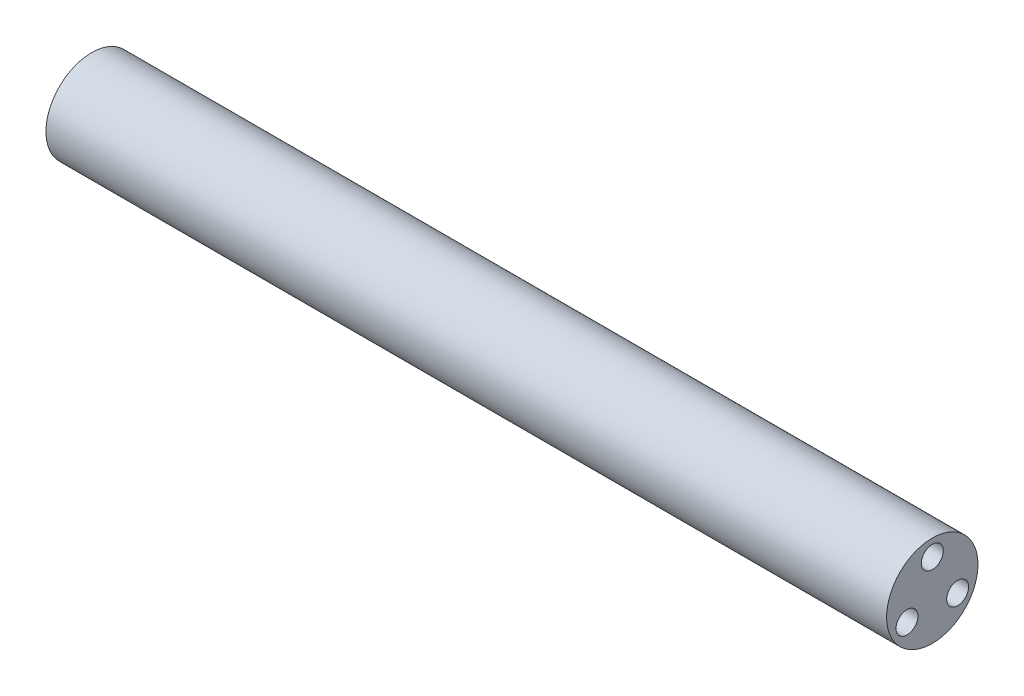
ISO-10303-21;
HEADER;
FILE_DESCRIPTION(('STEP AP214'),'2;1');
FILE_NAME('part.step','',(''),(''),'','','');
FILE_SCHEMA(('AUTOMOTIVE_DESIGN { 1 0 10303 214 1 1 1 1 }'));
ENDSEC;
DATA;
#1=APPLICATION_CONTEXT('core data for automotive mechanical design processes');
#2=APPLICATION_PROTOCOL_DEFINITION('international standard','automotive_design',2000,#1);
#3=PRODUCT_CONTEXT('',#1,'mechanical');
#4=PRODUCT('Part','Part','',(#3));
#5=PRODUCT_RELATED_PRODUCT_CATEGORY('part','',(#4));
#6=PRODUCT_DEFINITION_FORMATION('','',#4);
#7=PRODUCT_DEFINITION_CONTEXT('part definition',#1,'design');
#8=PRODUCT_DEFINITION('design','',#6,#7);
#9=PRODUCT_DEFINITION_SHAPE('','',#8);
#10=(LENGTH_UNIT() NAMED_UNIT(*) SI_UNIT(.MILLI.,.METRE.));
#11=(NAMED_UNIT(*) PLANE_ANGLE_UNIT() SI_UNIT($,.RADIAN.));
#12=(NAMED_UNIT(*) SI_UNIT($,.STERADIAN.) SOLID_ANGLE_UNIT());
#13=UNCERTAINTY_MEASURE_WITH_UNIT(LENGTH_MEASURE(1.E-05),#10,'distance_accuracy_value','');
#14=(GEOMETRIC_REPRESENTATION_CONTEXT(3) GLOBAL_UNCERTAINTY_ASSIGNED_CONTEXT((#13)) GLOBAL_UNIT_ASSIGNED_CONTEXT((#10,
#11,#12)) REPRESENTATION_CONTEXT('',''));
#15=CARTESIAN_POINT('',(0.,0.,0.));
#16=DIRECTION('',(0.,0.,1.));
#17=DIRECTION('',(1.,0.,0.));
#18=AXIS2_PLACEMENT_3D('',#15,#16,#17);
#19=CARTESIAN_POINT('',(230.,0.,0.));
#20=DIRECTION('',(-1.,0.,0.));
#21=DIRECTION('',(0.,0.,1.));
#22=AXIS2_PLACEMENT_3D('',#19,#20,#21);
#23=CYLINDRICAL_SURFACE('',#22,12.5);
#24=CARTESIAN_POINT('',(230.,0.,0.));
#25=DIRECTION('',(1.,0.,0.));
#26=DIRECTION('',(0.,0.,-1.));
#27=AXIS2_PLACEMENT_3D('',#24,#25,#26);
#28=CIRCLE('',#27,12.5);
#29=CARTESIAN_POINT('',(230.,0.,-12.5));
#30=VERTEX_POINT('',#29);
#31=EDGE_CURVE('E10',#30,#30,#28,.T.);
#32=ORIENTED_EDGE('',*,*,#31,.F.);
#33=EDGE_LOOP('',(#32));
#34=FACE_BOUND('',#33,.T.);
#35=CARTESIAN_POINT('',(0.,0.,0.));
#36=DIRECTION('',(1.,0.,0.));
#37=DIRECTION('',(0.,0.,-1.));
#38=AXIS2_PLACEMENT_3D('',#35,#36,#37);
#39=CIRCLE('',#38,12.5);
#40=CARTESIAN_POINT('',(0.,0.,-12.5));
#41=VERTEX_POINT('',#40);
#42=EDGE_CURVE('E42',#41,#41,#39,.T.);
#43=ORIENTED_EDGE('',*,*,#42,.T.);
#44=EDGE_LOOP('',(#43));
#45=FACE_BOUND('',#44,.T.);
#46=ADVANCED_FACE('F39',(#34,#45),#23,.T.);
#47=CARTESIAN_POINT('',(230.,0.,0.));
#48=DIRECTION('',(1.,0.,0.));
#49=DIRECTION('',(0.,0.,-1.));
#50=AXIS2_PLACEMENT_3D('',#47,#48,#49);
#51=PLANE('',#50);
#52=CARTESIAN_POINT('',(230.,-4.00000000000003,-6.92820323027549));
#53=DIRECTION('',(1.,0.,0.));
#54=DIRECTION('',(0.,-0.866025403784436,0.500000000000004));
#55=AXIS2_PLACEMENT_3D('',#52,#53,#54);
#56=CIRCLE('',#55,3.);
#57=CARTESIAN_POINT('',(230.,-6.59807621135334,-5.42820323027548));
#58=VERTEX_POINT('',#57);
#59=EDGE_CURVE('E64',#58,#58,#56,.T.);
#60=ORIENTED_EDGE('',*,*,#59,.F.);
#61=EDGE_LOOP('',(#60));
#62=FACE_BOUND('',#61,.T.);
#63=CARTESIAN_POINT('',(230.,-3.99999999999994,6.92820323027555));
#64=DIRECTION('',(1.,0.,0.));
#65=DIRECTION('',(0.,0.866025403784443,0.499999999999992));
#66=AXIS2_PLACEMENT_3D('',#63,#64,#65);
#67=CIRCLE('',#66,3.);
#68=CARTESIAN_POINT('',(230.,-1.40192378864661,8.42820323027552));
#69=VERTEX_POINT('',#68);
#70=EDGE_CURVE('E57',#69,#69,#67,.T.);
#71=ORIENTED_EDGE('',*,*,#70,.F.);
#72=EDGE_LOOP('',(#71));
#73=FACE_BOUND('',#72,.T.);
#74=CARTESIAN_POINT('',(230.,8.,0.));
#75=DIRECTION('',(1.,0.,0.));
#76=DIRECTION('',(0.,0.,-1.));
#77=AXIS2_PLACEMENT_3D('',#74,#75,#76);
#78=CIRCLE('',#77,3.);
#79=CARTESIAN_POINT('',(230.,8.,-3.));
#80=VERTEX_POINT('',#79);
#81=EDGE_CURVE('E51',#80,#80,#78,.T.);
#82=ORIENTED_EDGE('',*,*,#81,.F.);
#83=EDGE_LOOP('',(#82));
#84=FACE_BOUND('',#83,.T.);
#85=ORIENTED_EDGE('',*,*,#31,.T.);
#86=EDGE_LOOP('',(#85));
#87=FACE_BOUND('',#86,.T.);
#88=ADVANCED_FACE('F99',(#62,#73,#84,#87),#51,.T.);
#89=CARTESIAN_POINT('',(0.,0.,0.));
#90=DIRECTION('',(1.,0.,0.));
#91=DIRECTION('',(0.,0.,-1.));
#92=AXIS2_PLACEMENT_3D('',#89,#90,#91);
#93=PLANE('',#92);
#94=CARTESIAN_POINT('',(0.,-4.00000000000003,-6.92820323027549));
#95=DIRECTION('',(1.,0.,0.));
#96=DIRECTION('',(0.,-0.866025403784436,0.500000000000004));
#97=AXIS2_PLACEMENT_3D('',#94,#95,#96);
#98=CIRCLE('',#97,3.);
#99=CARTESIAN_POINT('',(0.,-6.59807621135334,-5.42820323027548));
#100=VERTEX_POINT('',#99);
#101=EDGE_CURVE('E81',#100,#100,#98,.T.);
#102=ORIENTED_EDGE('',*,*,#101,.T.);
#103=EDGE_LOOP('',(#102));
#104=FACE_BOUND('',#103,.T.);
#105=CARTESIAN_POINT('',(0.,-3.99999999999994,6.92820323027555));
#106=DIRECTION('',(1.,0.,0.));
#107=DIRECTION('',(0.,0.866025403784443,0.499999999999992));
#108=AXIS2_PLACEMENT_3D('',#105,#106,#107);
#109=CIRCLE('',#108,3.);
#110=CARTESIAN_POINT('',(0.,-1.40192378864661,8.42820323027552));
#111=VERTEX_POINT('',#110);
#112=EDGE_CURVE('E75',#111,#111,#109,.T.);
#113=ORIENTED_EDGE('',*,*,#112,.T.);
#114=EDGE_LOOP('',(#113));
#115=FACE_BOUND('',#114,.T.);
#116=CARTESIAN_POINT('',(0.,8.,0.));
#117=DIRECTION('',(1.,0.,0.));
#118=DIRECTION('',(0.,0.,-1.));
#119=AXIS2_PLACEMENT_3D('',#116,#117,#118);
#120=CIRCLE('',#119,3.);
#121=CARTESIAN_POINT('',(0.,8.,-3.));
#122=VERTEX_POINT('',#121);
#123=EDGE_CURVE('E69',#122,#122,#120,.T.);
#124=ORIENTED_EDGE('',*,*,#123,.T.);
#125=EDGE_LOOP('',(#124));
#126=FACE_BOUND('',#125,.T.);
#127=ORIENTED_EDGE('',*,*,#42,.F.);
#128=EDGE_LOOP('',(#127));
#129=FACE_BOUND('',#128,.T.);
#130=ADVANCED_FACE('F105',(#104,#115,#126,#129),#93,.F.);
#131=CARTESIAN_POINT('',(210.,8.,0.));
#132=DIRECTION('',(1.,0.,0.));
#133=DIRECTION('',(0.,0.,-1.));
#134=AXIS2_PLACEMENT_3D('',#131,#132,#133);
#135=CYLINDRICAL_SURFACE('',#134,3.);
#136=CARTESIAN_POINT('',(210.,8.,0.));
#137=DIRECTION('',(1.,0.,0.));
#138=DIRECTION('',(0.,0.,-1.));
#139=AXIS2_PLACEMENT_3D('',#136,#137,#138);
#140=CIRCLE('',#139,3.);
#141=CARTESIAN_POINT('',(210.,8.,-3.));
#142=VERTEX_POINT('',#141);
#143=EDGE_CURVE('E49',#142,#142,#140,.T.);
#144=ORIENTED_EDGE('',*,*,#143,.F.);
#145=EDGE_LOOP('',(#144));
#146=FACE_BOUND('',#145,.T.);
#147=ORIENTED_EDGE('',*,*,#81,.T.);
#148=EDGE_LOOP('',(#147));
#149=FACE_BOUND('',#148,.T.);
#150=ADVANCED_FACE('F112',(#146,#149),#135,.F.);
#151=CARTESIAN_POINT('',(210.,0.,0.));
#152=DIRECTION('',(1.,0.,0.));
#153=DIRECTION('',(0.,0.,-1.));
#154=AXIS2_PLACEMENT_3D('',#151,#152,#153);
#155=PLANE('',#154);
#156=ORIENTED_EDGE('',*,*,#143,.T.);
#157=EDGE_LOOP('',(#156));
#158=FACE_BOUND('',#157,.T.);
#159=ADVANCED_FACE('F118',(#158),#155,.T.);
#160=CARTESIAN_POINT('',(210.,-3.99999999999994,6.92820323027555));
#161=DIRECTION('',(1.,0.,0.));
#162=DIRECTION('',(0.,0.,-1.));
#163=AXIS2_PLACEMENT_3D('',#160,#161,#162);
#164=CYLINDRICAL_SURFACE('',#163,3.);
#165=CARTESIAN_POINT('',(210.,-3.99999999999994,6.92820323027555));
#166=DIRECTION('',(1.,0.,0.));
#167=DIRECTION('',(0.,0.866025403784443,0.499999999999992));
#168=AXIS2_PLACEMENT_3D('',#165,#166,#167);
#169=CIRCLE('',#168,3.);
#170=CARTESIAN_POINT('',(210.,-1.40192378864661,8.42820323027552));
#171=VERTEX_POINT('',#170);
#172=EDGE_CURVE('E60',#171,#171,#169,.T.);
#173=ORIENTED_EDGE('',*,*,#172,.F.);
#174=EDGE_LOOP('',(#173));
#175=FACE_BOUND('',#174,.T.);
#176=ORIENTED_EDGE('',*,*,#70,.T.);
#177=EDGE_LOOP('',(#176));
#178=FACE_BOUND('',#177,.T.);
#179=ADVANCED_FACE('F125',(#175,#178),#164,.F.);
#180=CARTESIAN_POINT('',(210.,0.,0.));
#181=DIRECTION('',(1.,0.,0.));
#182=DIRECTION('',(0.,0.866025403784443,0.499999999999992));
#183=AXIS2_PLACEMENT_3D('',#180,#181,#182);
#184=PLANE('',#183);
#185=ORIENTED_EDGE('',*,*,#172,.T.);
#186=EDGE_LOOP('',(#185));
#187=FACE_BOUND('',#186,.T.);
#188=ADVANCED_FACE('F129',(#187),#184,.T.);
#189=CARTESIAN_POINT('',(210.,-4.00000000000003,-6.92820323027549));
#190=DIRECTION('',(1.,0.,0.));
#191=DIRECTION('',(0.,0.,-1.));
#192=AXIS2_PLACEMENT_3D('',#189,#190,#191);
#193=CYLINDRICAL_SURFACE('',#192,3.);
#194=CARTESIAN_POINT('',(210.,-4.00000000000003,-6.92820323027549));
#195=DIRECTION('',(1.,0.,0.));
#196=DIRECTION('',(0.,-0.866025403784436,0.500000000000004));
#197=AXIS2_PLACEMENT_3D('',#194,#195,#196);
#198=CIRCLE('',#197,3.);
#199=CARTESIAN_POINT('',(210.,-6.59807621135334,-5.42820323027548));
#200=VERTEX_POINT('',#199);
#201=EDGE_CURVE('E54',#200,#200,#198,.T.);
#202=ORIENTED_EDGE('',*,*,#201,.F.);
#203=EDGE_LOOP('',(#202));
#204=FACE_BOUND('',#203,.T.);
#205=ORIENTED_EDGE('',*,*,#59,.T.);
#206=EDGE_LOOP('',(#205));
#207=FACE_BOUND('',#206,.T.);
#208=ADVANCED_FACE('F133',(#204,#207),#193,.F.);
#209=CARTESIAN_POINT('',(210.,0.,0.));
#210=DIRECTION('',(1.,0.,0.));
#211=DIRECTION('',(0.,-0.866025403784436,0.500000000000004));
#212=AXIS2_PLACEMENT_3D('',#209,#210,#211);
#213=PLANE('',#212);
#214=ORIENTED_EDGE('',*,*,#201,.T.);
#215=EDGE_LOOP('',(#214));
#216=FACE_BOUND('',#215,.T.);
#217=ADVANCED_FACE('F137',(#216),#213,.T.);
#218=CARTESIAN_POINT('',(20.,8.,0.));
#219=DIRECTION('',(-1.,0.,0.));
#220=DIRECTION('',(0.,0.,1.));
#221=AXIS2_PLACEMENT_3D('',#218,#219,#220);
#222=CYLINDRICAL_SURFACE('',#221,3.);
#223=CARTESIAN_POINT('',(20.,8.,0.));
#224=DIRECTION('',(1.,0.,0.));
#225=DIRECTION('',(0.,0.,-1.));
#226=AXIS2_PLACEMENT_3D('',#223,#224,#225);
#227=CIRCLE('',#226,3.);
#228=CARTESIAN_POINT('',(20.,8.,-3.));
#229=VERTEX_POINT('',#228);
#230=EDGE_CURVE('E61',#229,#229,#227,.T.);
#231=ORIENTED_EDGE('',*,*,#230,.T.);
#232=EDGE_LOOP('',(#231));
#233=FACE_BOUND('',#232,.T.);
#234=ORIENTED_EDGE('',*,*,#123,.F.);
#235=EDGE_LOOP('',(#234));
#236=FACE_BOUND('',#235,.T.);
#237=ADVANCED_FACE('F140',(#233,#236),#222,.F.);
#238=CARTESIAN_POINT('',(20.,0.,0.));
#239=DIRECTION('',(-1.,0.,0.));
#240=DIRECTION('',(0.,0.,-1.));
#241=AXIS2_PLACEMENT_3D('',#238,#239,#240);
#242=PLANE('',#241);
#243=ORIENTED_EDGE('',*,*,#230,.F.);
#244=EDGE_LOOP('',(#243));
#245=FACE_BOUND('',#244,.T.);
#246=ADVANCED_FACE('F143',(#245),#242,.T.);
#247=CARTESIAN_POINT('',(20.,-3.99999999999994,6.92820323027555));
#248=DIRECTION('',(-1.,0.,0.));
#249=DIRECTION('',(0.,0.,1.));
#250=AXIS2_PLACEMENT_3D('',#247,#248,#249);
#251=CYLINDRICAL_SURFACE('',#250,3.);
#252=CARTESIAN_POINT('',(20.,-3.99999999999994,6.92820323027555));
#253=DIRECTION('',(1.,0.,0.));
#254=DIRECTION('',(0.,0.866025403784443,0.499999999999992));
#255=AXIS2_PLACEMENT_3D('',#252,#253,#254);
#256=CIRCLE('',#255,3.);
#257=CARTESIAN_POINT('',(20.,-1.40192378864661,8.42820323027552));
#258=VERTEX_POINT('',#257);
#259=EDGE_CURVE('E78',#258,#258,#256,.T.);
#260=ORIENTED_EDGE('',*,*,#259,.T.);
#261=EDGE_LOOP('',(#260));
#262=FACE_BOUND('',#261,.T.);
#263=ORIENTED_EDGE('',*,*,#112,.F.);
#264=EDGE_LOOP('',(#263));
#265=FACE_BOUND('',#264,.T.);
#266=ADVANCED_FACE('F147',(#262,#265),#251,.F.);
#267=CARTESIAN_POINT('',(20.,0.,0.));
#268=DIRECTION('',(-1.,0.,0.));
#269=DIRECTION('',(0.,0.866025403784443,0.499999999999992));
#270=AXIS2_PLACEMENT_3D('',#267,#268,#269);
#271=PLANE('',#270);
#272=ORIENTED_EDGE('',*,*,#259,.F.);
#273=EDGE_LOOP('',(#272));
#274=FACE_BOUND('',#273,.T.);
#275=ADVANCED_FACE('F96',(#274),#271,.T.);
#276=CARTESIAN_POINT('',(20.,-4.00000000000003,-6.92820323027549));
#277=DIRECTION('',(-1.,0.,0.));
#278=DIRECTION('',(0.,0.,1.));
#279=AXIS2_PLACEMENT_3D('',#276,#277,#278);
#280=CYLINDRICAL_SURFACE('',#279,3.);
#281=CARTESIAN_POINT('',(20.,-4.00000000000003,-6.92820323027549));
#282=DIRECTION('',(1.,0.,0.));
#283=DIRECTION('',(0.,-0.866025403784436,0.500000000000004));
#284=AXIS2_PLACEMENT_3D('',#281,#282,#283);
#285=CIRCLE('',#284,3.);
#286=CARTESIAN_POINT('',(20.,-6.59807621135334,-5.42820323027548));
#287=VERTEX_POINT('',#286);
#288=EDGE_CURVE('E72',#287,#287,#285,.T.);
#289=ORIENTED_EDGE('',*,*,#288,.T.);
#290=EDGE_LOOP('',(#289));
#291=FACE_BOUND('',#290,.T.);
#292=ORIENTED_EDGE('',*,*,#101,.F.);
#293=EDGE_LOOP('',(#292));
#294=FACE_BOUND('',#293,.T.);
#295=ADVANCED_FACE('F87',(#291,#294),#280,.F.);
#296=CARTESIAN_POINT('',(20.,0.,0.));
#297=DIRECTION('',(-1.,0.,0.));
#298=DIRECTION('',(0.,-0.866025403784436,0.500000000000004));
#299=AXIS2_PLACEMENT_3D('',#296,#297,#298);
#300=PLANE('',#299);
#301=ORIENTED_EDGE('',*,*,#288,.F.);
#302=EDGE_LOOP('',(#301));
#303=FACE_BOUND('',#302,.T.);
#304=ADVANCED_FACE('F90',(#303),#300,.T.);
#305=CLOSED_SHELL('',(#46,#88,#130,#150,#159,#179,#188,#208,#217,#237,#246,#266,#275,#295,#304));
#306=MANIFOLD_SOLID_BREP('B2',#305);
#307=ADVANCED_BREP_SHAPE_REPRESENTATION('',(#18,#306),#14);
#308=SHAPE_DEFINITION_REPRESENTATION(#9,#307);
ENDSEC;
END-ISO-10303-21;
